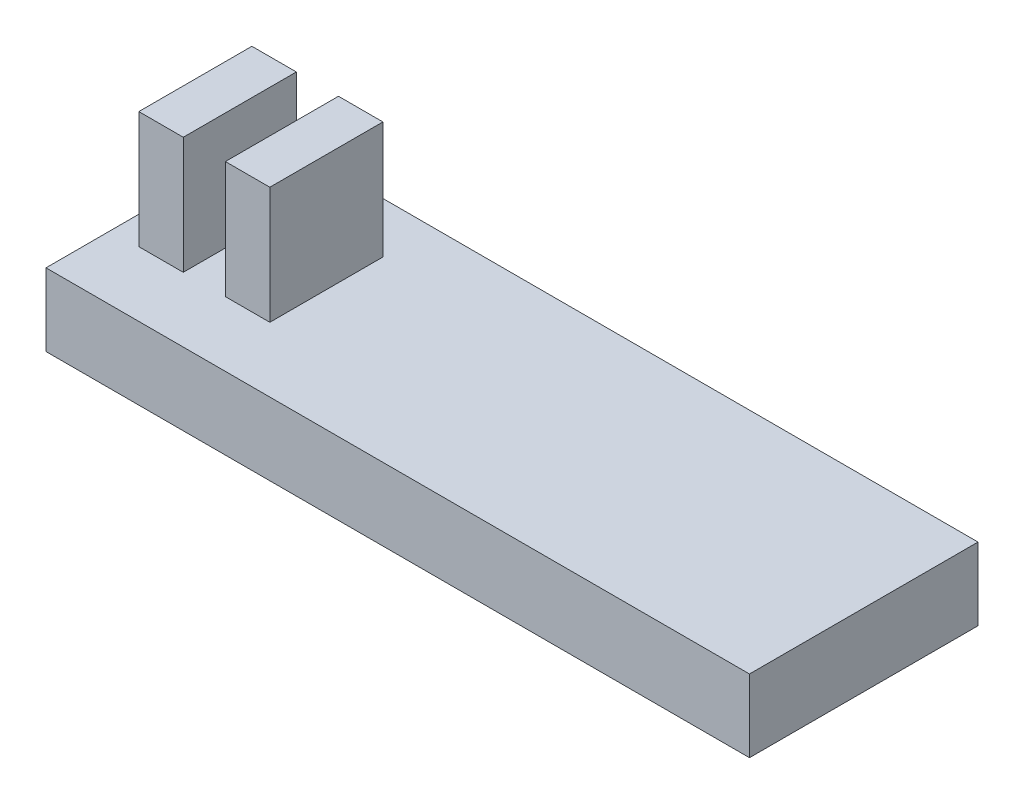
ISO-10303-21;
HEADER;
FILE_DESCRIPTION(('STEP AP214'),'2;1');
FILE_NAME('part.step','',(''),(''),'','','');
FILE_SCHEMA(('AUTOMOTIVE_DESIGN { 1 0 10303 214 1 1 1 1 }'));
ENDSEC;
DATA;
#1=APPLICATION_CONTEXT('core data for automotive mechanical design processes');
#2=APPLICATION_PROTOCOL_DEFINITION('international standard','automotive_design',2000,#1);
#3=PRODUCT_CONTEXT('',#1,'mechanical');
#4=PRODUCT('Part','Part','',(#3));
#5=PRODUCT_RELATED_PRODUCT_CATEGORY('part','',(#4));
#6=PRODUCT_DEFINITION_FORMATION('','',#4);
#7=PRODUCT_DEFINITION_CONTEXT('part definition',#1,'design');
#8=PRODUCT_DEFINITION('design','',#6,#7);
#9=PRODUCT_DEFINITION_SHAPE('','',#8);
#10=(LENGTH_UNIT() NAMED_UNIT(*) SI_UNIT(.MILLI.,.METRE.));
#11=(NAMED_UNIT(*) PLANE_ANGLE_UNIT() SI_UNIT($,.RADIAN.));
#12=(NAMED_UNIT(*) SI_UNIT($,.STERADIAN.) SOLID_ANGLE_UNIT());
#13=UNCERTAINTY_MEASURE_WITH_UNIT(LENGTH_MEASURE(1.E-05),#10,'distance_accuracy_value','');
#14=(GEOMETRIC_REPRESENTATION_CONTEXT(3) GLOBAL_UNCERTAINTY_ASSIGNED_CONTEXT((#13)) GLOBAL_UNIT_ASSIGNED_CONTEXT((#10,
#11,#12)) REPRESENTATION_CONTEXT('',''));
#15=CARTESIAN_POINT('',(0.,0.,0.));
#16=DIRECTION('',(0.,0.,1.));
#17=DIRECTION('',(1.,0.,0.));
#18=AXIS2_PLACEMENT_3D('',#15,#16,#17);
#19=CARTESIAN_POINT('',(45.1,9.3,14.65));
#20=DIRECTION('',(0.,1.,0.));
#21=DIRECTION('',(0.,0.,1.));
#22=AXIS2_PLACEMENT_3D('',#19,#20,#21);
#23=PLANE('',#22);
#24=DIRECTION('',(1.,0.,0.));
#25=VECTOR('',#24,1.);
#26=CARTESIAN_POINT('',(-41.5,9.3,6.35));
#27=LINE('',#26,#25);
#28=CARTESIAN_POINT('',(-41.5,9.3,6.35));
#29=VERTEX_POINT('',#28);
#30=CARTESIAN_POINT('',(-35.8,9.3,6.35));
#31=VERTEX_POINT('',#30);
#32=EDGE_CURVE('E156',#29,#31,#27,.T.);
#33=ORIENTED_EDGE('',*,*,#32,.F.);
#34=DIRECTION('',(0.,0.,1.));
#35=VECTOR('',#34,1.);
#36=CARTESIAN_POINT('',(-41.5,9.3,-8.15));
#37=LINE('',#36,#35);
#38=CARTESIAN_POINT('',(-41.5,9.3,-8.15));
#39=VERTEX_POINT('',#38);
#40=EDGE_CURVE('E153',#39,#29,#37,.T.);
#41=ORIENTED_EDGE('',*,*,#40,.F.);
#42=DIRECTION('',(-1.,0.,0.));
#43=VECTOR('',#42,1.);
#44=CARTESIAN_POINT('',(-41.5,9.3,-8.15));
#45=LINE('',#44,#43);
#46=CARTESIAN_POINT('',(-35.8,9.3,-8.15));
#47=VERTEX_POINT('',#46);
#48=EDGE_CURVE('E165',#47,#39,#45,.T.);
#49=ORIENTED_EDGE('',*,*,#48,.F.);
#50=DIRECTION('',(0.,0.,-1.));
#51=VECTOR('',#50,1.);
#52=CARTESIAN_POINT('',(-35.8,9.3,-8.15));
#53=LINE('',#52,#51);
#54=EDGE_CURVE('E173',#31,#47,#53,.T.);
#55=ORIENTED_EDGE('',*,*,#54,.F.);
#56=EDGE_LOOP('',(#33,#41,#49,#55));
#57=FACE_BOUND('',#56,.T.);
#58=DIRECTION('',(0.,0.,-1.));
#59=VECTOR('',#58,1.);
#60=CARTESIAN_POINT('',(45.1,9.3,-14.65));
#61=LINE('',#60,#59);
#62=CARTESIAN_POINT('',(45.1,9.3,14.65));
#63=VERTEX_POINT('',#62);
#64=CARTESIAN_POINT('',(45.1,9.3,-14.65));
#65=VERTEX_POINT('',#64);
#66=EDGE_CURVE('E185',#63,#65,#61,.T.);
#67=ORIENTED_EDGE('',*,*,#66,.T.);
#68=DIRECTION('',(-1.,0.,0.));
#69=VECTOR('',#68,1.);
#70=CARTESIAN_POINT('',(-45.1,9.3,-14.65));
#71=LINE('',#70,#69);
#72=CARTESIAN_POINT('',(-45.1,9.3,-14.65));
#73=VERTEX_POINT('',#72);
#74=EDGE_CURVE('E188',#65,#73,#71,.T.);
#75=ORIENTED_EDGE('',*,*,#74,.T.);
#76=DIRECTION('',(0.,0.,1.));
#77=VECTOR('',#76,1.);
#78=CARTESIAN_POINT('',(-45.1,9.3,-14.65));
#79=LINE('',#78,#77);
#80=CARTESIAN_POINT('',(-45.1,9.3,14.65));
#81=VERTEX_POINT('',#80);
#82=EDGE_CURVE('E191',#73,#81,#79,.T.);
#83=ORIENTED_EDGE('',*,*,#82,.T.);
#84=DIRECTION('',(1.,0.,0.));
#85=VECTOR('',#84,1.);
#86=CARTESIAN_POINT('',(-45.1,9.3,14.65));
#87=LINE('',#86,#85);
#88=EDGE_CURVE('E193',#81,#63,#87,.T.);
#89=ORIENTED_EDGE('',*,*,#88,.T.);
#90=EDGE_LOOP('',(#67,#75,#83,#89));
#91=FACE_BOUND('',#90,.T.);
#92=DIRECTION('',(1.,0.,0.));
#93=VECTOR('',#92,1.);
#94=CARTESIAN_POINT('',(-30.4,9.3,6.35));
#95=LINE('',#94,#93);
#96=CARTESIAN_POINT('',(-30.4,9.3,6.35));
#97=VERTEX_POINT('',#96);
#98=CARTESIAN_POINT('',(-24.7,9.3,6.35));
#99=VERTEX_POINT('',#98);
#100=EDGE_CURVE('E395',#97,#99,#95,.T.);
#101=ORIENTED_EDGE('',*,*,#100,.F.);
#102=DIRECTION('',(0.,0.,1.));
#103=VECTOR('',#102,1.);
#104=CARTESIAN_POINT('',(-30.4,9.3,-8.15));
#105=LINE('',#104,#103);
#106=CARTESIAN_POINT('',(-30.4,9.3,-8.15));
#107=VERTEX_POINT('',#106);
#108=EDGE_CURVE('E151',#107,#97,#105,.T.);
#109=ORIENTED_EDGE('',*,*,#108,.F.);
#110=DIRECTION('',(-1.,0.,0.));
#111=VECTOR('',#110,1.);
#112=CARTESIAN_POINT('',(-30.4,9.3,-8.15));
#113=LINE('',#112,#111);
#114=CARTESIAN_POINT('',(-24.7,9.3,-8.15));
#115=VERTEX_POINT('',#114);
#116=EDGE_CURVE('E147',#115,#107,#113,.T.);
#117=ORIENTED_EDGE('',*,*,#116,.F.);
#118=DIRECTION('',(0.,0.,-1.));
#119=VECTOR('',#118,1.);
#120=CARTESIAN_POINT('',(-24.7,9.3,-8.15));
#121=LINE('',#120,#119);
#122=EDGE_CURVE('E392',#99,#115,#121,.T.);
#123=ORIENTED_EDGE('',*,*,#122,.F.);
#124=EDGE_LOOP('',(#101,#109,#117,#123));
#125=FACE_BOUND('',#124,.T.);
#126=ADVANCED_FACE('F38',(#57,#91,#125),#23,.T.);
#127=CARTESIAN_POINT('',(45.1,9.3,-14.65));
#128=DIRECTION('',(-1.,0.,0.));
#129=DIRECTION('',(0.,0.,1.));
#130=AXIS2_PLACEMENT_3D('',#127,#128,#129);
#131=PLANE('',#130);
#132=DIRECTION('',(0.,0.,-1.));
#133=VECTOR('',#132,1.);
#134=CARTESIAN_POINT('',(45.1,0.,-14.65));
#135=LINE('',#134,#133);
#136=CARTESIAN_POINT('',(45.1,0.,14.65));
#137=VERTEX_POINT('',#136);
#138=CARTESIAN_POINT('',(45.1,0.,-14.65));
#139=VERTEX_POINT('',#138);
#140=EDGE_CURVE('E184',#137,#139,#135,.T.);
#141=ORIENTED_EDGE('',*,*,#140,.T.);
#142=DIRECTION('',(0.,-1.,0.));
#143=VECTOR('',#142,1.);
#144=CARTESIAN_POINT('',(45.1,9.3,-14.65));
#145=LINE('',#144,#143);
#146=EDGE_CURVE('E11',#65,#139,#145,.T.);
#147=ORIENTED_EDGE('',*,*,#146,.F.);
#148=ORIENTED_EDGE('',*,*,#66,.F.);
#149=DIRECTION('',(0.,-1.,0.));
#150=VECTOR('',#149,1.);
#151=CARTESIAN_POINT('',(45.1,9.3,14.65));
#152=LINE('',#151,#150);
#153=EDGE_CURVE('E195',#63,#137,#152,.T.);
#154=ORIENTED_EDGE('',*,*,#153,.T.);
#155=EDGE_LOOP('',(#141,#147,#148,#154));
#156=FACE_BOUND('',#155,.T.);
#157=ADVANCED_FACE('F40',(#156),#131,.F.);
#158=CARTESIAN_POINT('',(-45.1,9.3,-14.65));
#159=DIRECTION('',(0.,0.,1.));
#160=DIRECTION('',(1.,0.,0.));
#161=AXIS2_PLACEMENT_3D('',#158,#159,#160);
#162=PLANE('',#161);
#163=DIRECTION('',(-1.,0.,0.));
#164=VECTOR('',#163,1.);
#165=CARTESIAN_POINT('',(-45.1,0.,-14.65));
#166=LINE('',#165,#164);
#167=CARTESIAN_POINT('',(-45.1,0.,-14.65));
#168=VERTEX_POINT('',#167);
#169=EDGE_CURVE('E198',#139,#168,#166,.T.);
#170=ORIENTED_EDGE('',*,*,#169,.T.);
#171=DIRECTION('',(0.,-1.,0.));
#172=VECTOR('',#171,1.);
#173=CARTESIAN_POINT('',(-45.1,9.3,-14.65));
#174=LINE('',#173,#172);
#175=EDGE_CURVE('E46',#73,#168,#174,.T.);
#176=ORIENTED_EDGE('',*,*,#175,.F.);
#177=ORIENTED_EDGE('',*,*,#74,.F.);
#178=ORIENTED_EDGE('',*,*,#146,.T.);
#179=EDGE_LOOP('',(#170,#176,#177,#178));
#180=FACE_BOUND('',#179,.T.);
#181=ADVANCED_FACE('F228',(#180),#162,.F.);
#182=CARTESIAN_POINT('',(-45.1,9.3,-14.65));
#183=DIRECTION('',(1.,0.,0.));
#184=DIRECTION('',(0.,0.,-1.));
#185=AXIS2_PLACEMENT_3D('',#182,#183,#184);
#186=PLANE('',#185);
#187=DIRECTION('',(0.,0.,1.));
#188=VECTOR('',#187,1.);
#189=CARTESIAN_POINT('',(-45.1,0.,-14.65));
#190=LINE('',#189,#188);
#191=CARTESIAN_POINT('',(-45.1,0.,14.65));
#192=VERTEX_POINT('',#191);
#193=EDGE_CURVE('E200',#168,#192,#190,.T.);
#194=ORIENTED_EDGE('',*,*,#193,.T.);
#195=DIRECTION('',(0.,-1.,0.));
#196=VECTOR('',#195,1.);
#197=CARTESIAN_POINT('',(-45.1,9.3,14.65));
#198=LINE('',#197,#196);
#199=EDGE_CURVE('E205',#81,#192,#198,.T.);
#200=ORIENTED_EDGE('',*,*,#199,.F.);
#201=ORIENTED_EDGE('',*,*,#82,.F.);
#202=ORIENTED_EDGE('',*,*,#175,.T.);
#203=EDGE_LOOP('',(#194,#200,#201,#202));
#204=FACE_BOUND('',#203,.T.);
#205=ADVANCED_FACE('F212',(#204),#186,.F.);
#206=CARTESIAN_POINT('',(-45.1,9.3,14.65));
#207=DIRECTION('',(0.,0.,-1.));
#208=DIRECTION('',(-1.,0.,0.));
#209=AXIS2_PLACEMENT_3D('',#206,#207,#208);
#210=PLANE('',#209);
#211=DIRECTION('',(1.,0.,0.));
#212=VECTOR('',#211,1.);
#213=CARTESIAN_POINT('',(-45.1,0.,14.65));
#214=LINE('',#213,#212);
#215=EDGE_CURVE('E189',#192,#137,#214,.T.);
#216=ORIENTED_EDGE('',*,*,#215,.T.);
#217=ORIENTED_EDGE('',*,*,#153,.F.);
#218=ORIENTED_EDGE('',*,*,#88,.F.);
#219=ORIENTED_EDGE('',*,*,#199,.T.);
#220=EDGE_LOOP('',(#216,#217,#218,#219));
#221=FACE_BOUND('',#220,.T.);
#222=ADVANCED_FACE('F221',(#221),#210,.F.);
#223=CARTESIAN_POINT('',(45.1,0.,14.65));
#224=DIRECTION('',(0.,1.,0.));
#225=DIRECTION('',(0.,0.,1.));
#226=AXIS2_PLACEMENT_3D('',#223,#224,#225);
#227=PLANE('',#226);
#228=ORIENTED_EDGE('',*,*,#140,.F.);
#229=ORIENTED_EDGE('',*,*,#215,.F.);
#230=ORIENTED_EDGE('',*,*,#193,.F.);
#231=ORIENTED_EDGE('',*,*,#169,.F.);
#232=EDGE_LOOP('',(#228,#229,#230,#231));
#233=FACE_BOUND('',#232,.T.);
#234=ADVANCED_FACE('F218',(#233),#227,.F.);
#235=CARTESIAN_POINT('',(-41.5,24.3,-8.15));
#236=DIRECTION('',(1.,0.,0.));
#237=DIRECTION('',(0.,0.,-1.));
#238=AXIS2_PLACEMENT_3D('',#235,#236,#237);
#239=PLANE('',#238);
#240=ORIENTED_EDGE('',*,*,#40,.T.);
#241=DIRECTION('',(0.,-1.,0.));
#242=VECTOR('',#241,1.);
#243=CARTESIAN_POINT('',(-41.5,24.3,6.35));
#244=LINE('',#243,#242);
#245=CARTESIAN_POINT('',(-41.5,24.3,6.35));
#246=VERTEX_POINT('',#245);
#247=EDGE_CURVE('E182',#246,#29,#244,.T.);
#248=ORIENTED_EDGE('',*,*,#247,.F.);
#249=DIRECTION('',(0.,0.,1.));
#250=VECTOR('',#249,1.);
#251=CARTESIAN_POINT('',(-41.5,24.3,-8.15));
#252=LINE('',#251,#250);
#253=CARTESIAN_POINT('',(-41.5,24.3,-8.15));
#254=VERTEX_POINT('',#253);
#255=EDGE_CURVE('E161',#254,#246,#252,.T.);
#256=ORIENTED_EDGE('',*,*,#255,.F.);
#257=DIRECTION('',(0.,-1.,0.));
#258=VECTOR('',#257,1.);
#259=CARTESIAN_POINT('',(-41.5,24.3,-8.15));
#260=LINE('',#259,#258);
#261=EDGE_CURVE('E170',#254,#39,#260,.T.);
#262=ORIENTED_EDGE('',*,*,#261,.T.);
#263=EDGE_LOOP('',(#240,#248,#256,#262));
#264=FACE_BOUND('',#263,.T.);
#265=ADVANCED_FACE('F243',(#264),#239,.F.);
#266=CARTESIAN_POINT('',(-41.5,24.3,6.35));
#267=DIRECTION('',(0.,0.,-1.));
#268=DIRECTION('',(-1.,0.,0.));
#269=AXIS2_PLACEMENT_3D('',#266,#267,#268);
#270=PLANE('',#269);
#271=ORIENTED_EDGE('',*,*,#32,.T.);
#272=DIRECTION('',(0.,-1.,0.));
#273=VECTOR('',#272,1.);
#274=CARTESIAN_POINT('',(-35.8,24.3,6.35));
#275=LINE('',#274,#273);
#276=CARTESIAN_POINT('',(-35.8,24.3,6.35));
#277=VERTEX_POINT('',#276);
#278=EDGE_CURVE('E179',#277,#31,#275,.T.);
#279=ORIENTED_EDGE('',*,*,#278,.F.);
#280=DIRECTION('',(1.,0.,0.));
#281=VECTOR('',#280,1.);
#282=CARTESIAN_POINT('',(-41.5,24.3,6.35));
#283=LINE('',#282,#281);
#284=EDGE_CURVE('E164',#246,#277,#283,.T.);
#285=ORIENTED_EDGE('',*,*,#284,.F.);
#286=ORIENTED_EDGE('',*,*,#247,.T.);
#287=EDGE_LOOP('',(#271,#279,#285,#286));
#288=FACE_BOUND('',#287,.T.);
#289=ADVANCED_FACE('F262',(#288),#270,.F.);
#290=CARTESIAN_POINT('',(-35.8,24.3,-8.15));
#291=DIRECTION('',(-1.,0.,0.));
#292=DIRECTION('',(0.,0.,1.));
#293=AXIS2_PLACEMENT_3D('',#290,#291,#292);
#294=PLANE('',#293);
#295=ORIENTED_EDGE('',*,*,#54,.T.);
#296=DIRECTION('',(0.,-1.,0.));
#297=VECTOR('',#296,1.);
#298=CARTESIAN_POINT('',(-35.8,24.3,-8.15));
#299=LINE('',#298,#297);
#300=CARTESIAN_POINT('',(-35.8,24.3,-8.15));
#301=VERTEX_POINT('',#300);
#302=EDGE_CURVE('E61',#301,#47,#299,.T.);
#303=ORIENTED_EDGE('',*,*,#302,.F.);
#304=DIRECTION('',(0.,0.,-1.));
#305=VECTOR('',#304,1.);
#306=CARTESIAN_POINT('',(-35.8,24.3,-8.15));
#307=LINE('',#306,#305);
#308=EDGE_CURVE('E167',#277,#301,#307,.T.);
#309=ORIENTED_EDGE('',*,*,#308,.F.);
#310=ORIENTED_EDGE('',*,*,#278,.T.);
#311=EDGE_LOOP('',(#295,#303,#309,#310));
#312=FACE_BOUND('',#311,.T.);
#313=ADVANCED_FACE('F270',(#312),#294,.F.);
#314=CARTESIAN_POINT('',(-41.5,24.3,-8.15));
#315=DIRECTION('',(0.,0.,1.));
#316=DIRECTION('',(1.,0.,0.));
#317=AXIS2_PLACEMENT_3D('',#314,#315,#316);
#318=PLANE('',#317);
#319=ORIENTED_EDGE('',*,*,#48,.T.);
#320=ORIENTED_EDGE('',*,*,#261,.F.);
#321=DIRECTION('',(-1.,0.,0.));
#322=VECTOR('',#321,1.);
#323=CARTESIAN_POINT('',(-41.5,24.3,-8.15));
#324=LINE('',#323,#322);
#325=EDGE_CURVE('E169',#301,#254,#324,.T.);
#326=ORIENTED_EDGE('',*,*,#325,.F.);
#327=ORIENTED_EDGE('',*,*,#302,.T.);
#328=EDGE_LOOP('',(#319,#320,#326,#327));
#329=FACE_BOUND('',#328,.T.);
#330=ADVANCED_FACE('F279',(#329),#318,.F.);
#331=CARTESIAN_POINT('',(-41.5,24.3,6.35));
#332=DIRECTION('',(0.,1.,0.));
#333=DIRECTION('',(0.,0.,1.));
#334=AXIS2_PLACEMENT_3D('',#331,#332,#333);
#335=PLANE('',#334);
#336=ORIENTED_EDGE('',*,*,#255,.T.);
#337=ORIENTED_EDGE('',*,*,#284,.T.);
#338=ORIENTED_EDGE('',*,*,#308,.T.);
#339=ORIENTED_EDGE('',*,*,#325,.T.);
#340=EDGE_LOOP('',(#336,#337,#338,#339));
#341=FACE_BOUND('',#340,.T.);
#342=ADVANCED_FACE('F288',(#341),#335,.T.);
#343=CARTESIAN_POINT('',(-30.4,24.3,-8.15));
#344=DIRECTION('',(1.,0.,0.));
#345=DIRECTION('',(0.,0.,-1.));
#346=AXIS2_PLACEMENT_3D('',#343,#344,#345);
#347=PLANE('',#346);
#348=ORIENTED_EDGE('',*,*,#108,.T.);
#349=DIRECTION('',(0.,-1.,0.));
#350=VECTOR('',#349,1.);
#351=CARTESIAN_POINT('',(-30.4,24.3,6.35));
#352=LINE('',#351,#350);
#353=CARTESIAN_POINT('',(-30.4,24.3,6.35));
#354=VERTEX_POINT('',#353);
#355=EDGE_CURVE('E132',#354,#97,#352,.T.);
#356=ORIENTED_EDGE('',*,*,#355,.F.);
#357=DIRECTION('',(0.,0.,1.));
#358=VECTOR('',#357,1.);
#359=CARTESIAN_POINT('',(-30.4,24.3,-8.15));
#360=LINE('',#359,#358);
#361=CARTESIAN_POINT('',(-30.4,24.3,-8.15));
#362=VERTEX_POINT('',#361);
#363=EDGE_CURVE('E139',#362,#354,#360,.T.);
#364=ORIENTED_EDGE('',*,*,#363,.F.);
#365=DIRECTION('',(0.,-1.,0.));
#366=VECTOR('',#365,1.);
#367=CARTESIAN_POINT('',(-30.4,24.3,-8.15));
#368=LINE('',#367,#366);
#369=EDGE_CURVE('E390',#362,#107,#368,.T.);
#370=ORIENTED_EDGE('',*,*,#369,.T.);
#371=EDGE_LOOP('',(#348,#356,#364,#370));
#372=FACE_BOUND('',#371,.T.);
#373=ADVANCED_FACE('F149',(#372),#347,.F.);
#374=CARTESIAN_POINT('',(-30.4,24.3,6.35));
#375=DIRECTION('',(0.,0.,-1.));
#376=DIRECTION('',(-1.,0.,0.));
#377=AXIS2_PLACEMENT_3D('',#374,#375,#376);
#378=PLANE('',#377);
#379=ORIENTED_EDGE('',*,*,#100,.T.);
#380=DIRECTION('',(0.,-1.,0.));
#381=VECTOR('',#380,1.);
#382=CARTESIAN_POINT('',(-24.7,24.3,6.35));
#383=LINE('',#382,#381);
#384=CARTESIAN_POINT('',(-24.7,24.3,6.35));
#385=VERTEX_POINT('',#384);
#386=EDGE_CURVE('E135',#385,#99,#383,.T.);
#387=ORIENTED_EDGE('',*,*,#386,.F.);
#388=DIRECTION('',(1.,0.,0.));
#389=VECTOR('',#388,1.);
#390=CARTESIAN_POINT('',(-30.4,24.3,6.35));
#391=LINE('',#390,#389);
#392=EDGE_CURVE('E128',#354,#385,#391,.T.);
#393=ORIENTED_EDGE('',*,*,#392,.F.);
#394=ORIENTED_EDGE('',*,*,#355,.T.);
#395=EDGE_LOOP('',(#379,#387,#393,#394));
#396=FACE_BOUND('',#395,.T.);
#397=ADVANCED_FACE('F130',(#396),#378,.F.);
#398=CARTESIAN_POINT('',(-24.7,24.3,-8.15));
#399=DIRECTION('',(-1.,0.,0.));
#400=DIRECTION('',(0.,0.,1.));
#401=AXIS2_PLACEMENT_3D('',#398,#399,#400);
#402=PLANE('',#401);
#403=ORIENTED_EDGE('',*,*,#122,.T.);
#404=DIRECTION('',(0.,-1.,0.));
#405=VECTOR('',#404,1.);
#406=CARTESIAN_POINT('',(-24.7,24.3,-8.15));
#407=LINE('',#406,#405);
#408=CARTESIAN_POINT('',(-24.7,24.3,-8.15));
#409=VERTEX_POINT('',#408);
#410=EDGE_CURVE('E53',#409,#115,#407,.T.);
#411=ORIENTED_EDGE('',*,*,#410,.F.);
#412=DIRECTION('',(0.,0.,-1.));
#413=VECTOR('',#412,1.);
#414=CARTESIAN_POINT('',(-24.7,24.3,-8.15));
#415=LINE('',#414,#413);
#416=EDGE_CURVE('E138',#385,#409,#415,.T.);
#417=ORIENTED_EDGE('',*,*,#416,.F.);
#418=ORIENTED_EDGE('',*,*,#386,.T.);
#419=EDGE_LOOP('',(#403,#411,#417,#418));
#420=FACE_BOUND('',#419,.T.);
#421=ADVANCED_FACE('F307',(#420),#402,.F.);
#422=CARTESIAN_POINT('',(-30.4,24.3,-8.15));
#423=DIRECTION('',(0.,0.,1.));
#424=DIRECTION('',(1.,0.,0.));
#425=AXIS2_PLACEMENT_3D('',#422,#423,#424);
#426=PLANE('',#425);
#427=ORIENTED_EDGE('',*,*,#116,.T.);
#428=ORIENTED_EDGE('',*,*,#369,.F.);
#429=DIRECTION('',(-1.,0.,0.));
#430=VECTOR('',#429,1.);
#431=CARTESIAN_POINT('',(-30.4,24.3,-8.15));
#432=LINE('',#431,#430);
#433=EDGE_CURVE('E143',#409,#362,#432,.T.);
#434=ORIENTED_EDGE('',*,*,#433,.F.);
#435=ORIENTED_EDGE('',*,*,#410,.T.);
#436=EDGE_LOOP('',(#427,#428,#434,#435));
#437=FACE_BOUND('',#436,.T.);
#438=ADVANCED_FACE('F313',(#437),#426,.F.);
#439=CARTESIAN_POINT('',(-30.4,24.3,6.35));
#440=DIRECTION('',(0.,1.,0.));
#441=DIRECTION('',(0.,0.,1.));
#442=AXIS2_PLACEMENT_3D('',#439,#440,#441);
#443=PLANE('',#442);
#444=ORIENTED_EDGE('',*,*,#363,.T.);
#445=ORIENTED_EDGE('',*,*,#392,.T.);
#446=ORIENTED_EDGE('',*,*,#416,.T.);
#447=ORIENTED_EDGE('',*,*,#433,.T.);
#448=EDGE_LOOP('',(#444,#445,#446,#447));
#449=FACE_BOUND('',#448,.T.);
#450=ADVANCED_FACE('F142',(#449),#443,.T.);
#451=CLOSED_SHELL('',(#126,#157,#181,#205,#222,#234,#265,#289,#313,#330,#342,#373,#397,#421,
#438,#450));
#452=MANIFOLD_SOLID_BREP('B2',#451);
#453=ADVANCED_BREP_SHAPE_REPRESENTATION('',(#18,#452),#14);
#454=SHAPE_DEFINITION_REPRESENTATION(#9,#453);
ENDSEC;
END-ISO-10303-21;
